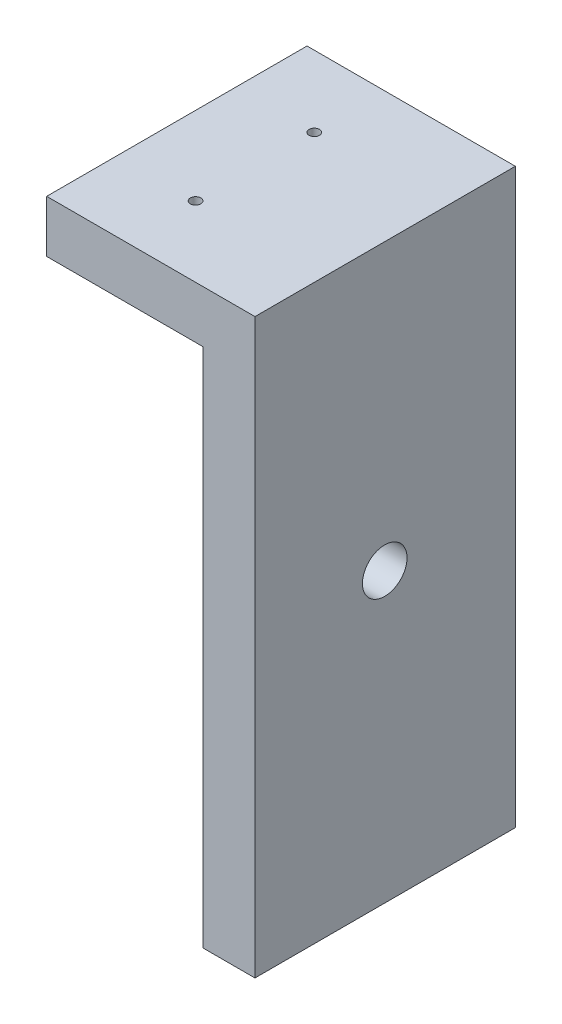
ISO-10303-21;
HEADER;
FILE_DESCRIPTION(('STEP AP214'),'2;1');
FILE_NAME('part.step','',(''),(''),'','','');
FILE_SCHEMA(('AUTOMOTIVE_DESIGN { 1 0 10303 214 1 1 1 1 }'));
ENDSEC;
DATA;
#1=APPLICATION_CONTEXT('core data for automotive mechanical design processes');
#2=APPLICATION_PROTOCOL_DEFINITION('international standard','automotive_design',2000,#1);
#3=PRODUCT_CONTEXT('',#1,'mechanical');
#4=PRODUCT('Part','Part','',(#3));
#5=PRODUCT_RELATED_PRODUCT_CATEGORY('part','',(#4));
#6=PRODUCT_DEFINITION_FORMATION('','',#4);
#7=PRODUCT_DEFINITION_CONTEXT('part definition',#1,'design');
#8=PRODUCT_DEFINITION('design','',#6,#7);
#9=PRODUCT_DEFINITION_SHAPE('','',#8);
#10=(LENGTH_UNIT() NAMED_UNIT(*) SI_UNIT(.MILLI.,.METRE.));
#11=(NAMED_UNIT(*) PLANE_ANGLE_UNIT() SI_UNIT($,.RADIAN.));
#12=(NAMED_UNIT(*) SI_UNIT($,.STERADIAN.) SOLID_ANGLE_UNIT());
#13=UNCERTAINTY_MEASURE_WITH_UNIT(LENGTH_MEASURE(1.E-05),#10,'distance_accuracy_value','');
#14=(GEOMETRIC_REPRESENTATION_CONTEXT(3) GLOBAL_UNCERTAINTY_ASSIGNED_CONTEXT((#13)) GLOBAL_UNIT_ASSIGNED_CONTEXT((#10,
#11,#12)) REPRESENTATION_CONTEXT('',''));
#15=CARTESIAN_POINT('',(0.,0.,0.));
#16=DIRECTION('',(0.,0.,1.));
#17=DIRECTION('',(1.,0.,0.));
#18=AXIS2_PLACEMENT_3D('',#15,#16,#17);
#19=CARTESIAN_POINT('',(0.,0.,5.));
#20=DIRECTION('',(1.,0.,0.));
#21=DIRECTION('',(0.,0.,-1.));
#22=AXIS2_PLACEMENT_3D('',#19,#20,#21);
#23=PLANE('',#22);
#24=CARTESIAN_POINT('',(0.,5.52898779877198,2.5080313411234));
#25=DIRECTION('',(1.,0.,0.));
#26=DIRECTION('',(0.,0.,-1.));
#27=AXIS2_PLACEMENT_3D('',#24,#25,#26);
#28=CIRCLE('',#27,0.42824506213834);
#29=CARTESIAN_POINT('',(0.,5.52898779877198,2.07978627898506));
#30=VERTEX_POINT('',#29);
#31=EDGE_CURVE('E88',#30,#30,#28,.T.);
#32=ORIENTED_EDGE('',*,*,#31,.T.);
#33=EDGE_LOOP('',(#32));
#34=FACE_BOUND('',#33,.T.);
#35=DIRECTION('',(0.,-1.,0.));
#36=VECTOR('',#35,1.);
#37=CARTESIAN_POINT('',(0.,0.,0.));
#38=LINE('',#37,#36);
#39=CARTESIAN_POINT('',(0.,10.,0.));
#40=VERTEX_POINT('',#39);
#41=CARTESIAN_POINT('',(0.,0.,0.));
#42=VERTEX_POINT('',#41);
#43=EDGE_CURVE('E95',#40,#42,#38,.T.);
#44=ORIENTED_EDGE('',*,*,#43,.T.);
#45=DIRECTION('',(0.,0.,-1.));
#46=VECTOR('',#45,1.);
#47=CARTESIAN_POINT('',(0.,0.,5.));
#48=LINE('',#47,#46);
#49=CARTESIAN_POINT('',(0.,0.,5.));
#50=VERTEX_POINT('',#49);
#51=EDGE_CURVE('E11',#50,#42,#48,.T.);
#52=ORIENTED_EDGE('',*,*,#51,.F.);
#53=DIRECTION('',(0.,-1.,0.));
#54=VECTOR('',#53,1.);
#55=CARTESIAN_POINT('',(0.,0.,5.));
#56=LINE('',#55,#54);
#57=CARTESIAN_POINT('',(0.,10.,5.));
#58=VERTEX_POINT('',#57);
#59=EDGE_CURVE('E91',#58,#50,#56,.T.);
#60=ORIENTED_EDGE('',*,*,#59,.F.);
#61=DIRECTION('',(0.,0.,-1.));
#62=VECTOR('',#61,1.);
#63=CARTESIAN_POINT('',(0.,10.,5.));
#64=LINE('',#63,#62);
#65=EDGE_CURVE('E80',#58,#40,#64,.T.);
#66=ORIENTED_EDGE('',*,*,#65,.T.);
#67=EDGE_LOOP('',(#44,#52,#60,#66));
#68=FACE_BOUND('',#67,.T.);
#69=ADVANCED_FACE('F39',(#34,#68),#23,.F.);
#70=CARTESIAN_POINT('',(0.,0.,5.));
#71=DIRECTION('',(0.,1.,0.));
#72=DIRECTION('',(0.,0.,1.));
#73=AXIS2_PLACEMENT_3D('',#70,#71,#72);
#74=PLANE('',#73);
#75=DIRECTION('',(1.,0.,0.));
#76=VECTOR('',#75,1.);
#77=CARTESIAN_POINT('',(0.,0.,0.));
#78=LINE('',#77,#76);
#79=CARTESIAN_POINT('',(1.,0.,0.));
#80=VERTEX_POINT('',#79);
#81=EDGE_CURVE('E66',#42,#80,#78,.T.);
#82=ORIENTED_EDGE('',*,*,#81,.T.);
#83=DIRECTION('',(0.,0.,-1.));
#84=VECTOR('',#83,1.);
#85=CARTESIAN_POINT('',(1.,0.,5.));
#86=LINE('',#85,#84);
#87=CARTESIAN_POINT('',(1.,0.,5.));
#88=VERTEX_POINT('',#87);
#89=EDGE_CURVE('E50',#88,#80,#86,.T.);
#90=ORIENTED_EDGE('',*,*,#89,.F.);
#91=DIRECTION('',(1.,0.,0.));
#92=VECTOR('',#91,1.);
#93=CARTESIAN_POINT('',(0.,0.,5.));
#94=LINE('',#93,#92);
#95=EDGE_CURVE('E54',#50,#88,#94,.T.);
#96=ORIENTED_EDGE('',*,*,#95,.F.);
#97=ORIENTED_EDGE('',*,*,#51,.T.);
#98=EDGE_LOOP('',(#82,#90,#96,#97));
#99=FACE_BOUND('',#98,.T.);
#100=ADVANCED_FACE('F153',(#99),#74,.F.);
#101=CARTESIAN_POINT('',(1.,0.,5.));
#102=DIRECTION('',(-1.,0.,0.));
#103=DIRECTION('',(0.,0.,1.));
#104=AXIS2_PLACEMENT_3D('',#101,#102,#103);
#105=PLANE('',#104);
#106=CARTESIAN_POINT('',(1.,5.52898779877198,2.5080313411234));
#107=DIRECTION('',(1.,0.,0.));
#108=DIRECTION('',(0.,0.,-1.));
#109=AXIS2_PLACEMENT_3D('',#106,#107,#108);
#110=CIRCLE('',#109,0.42824506213834);
#111=CARTESIAN_POINT('',(1.,5.52898779877198,2.07978627898506));
#112=VERTEX_POINT('',#111);
#113=EDGE_CURVE('E133',#112,#112,#110,.T.);
#114=ORIENTED_EDGE('',*,*,#113,.F.);
#115=EDGE_LOOP('',(#114));
#116=FACE_BOUND('',#115,.T.);
#117=DIRECTION('',(0.,1.,0.));
#118=VECTOR('',#117,1.);
#119=CARTESIAN_POINT('',(1.,0.,0.));
#120=LINE('',#119,#118);
#121=CARTESIAN_POINT('',(1.,11.,0.));
#122=VERTEX_POINT('',#121);
#123=EDGE_CURVE('E99',#80,#122,#120,.T.);
#124=ORIENTED_EDGE('',*,*,#123,.T.);
#125=DIRECTION('',(0.,0.,-1.));
#126=VECTOR('',#125,1.);
#127=CARTESIAN_POINT('',(1.,11.,0.));
#128=LINE('',#127,#126);
#129=CARTESIAN_POINT('',(1.,11.,5.));
#130=VERTEX_POINT('',#129);
#131=EDGE_CURVE('E123',#130,#122,#128,.T.);
#132=ORIENTED_EDGE('',*,*,#131,.F.);
#133=DIRECTION('',(0.,1.,0.));
#134=VECTOR('',#133,1.);
#135=CARTESIAN_POINT('',(1.,0.,5.));
#136=LINE('',#135,#134);
#137=EDGE_CURVE('E94',#88,#130,#136,.T.);
#138=ORIENTED_EDGE('',*,*,#137,.F.);
#139=ORIENTED_EDGE('',*,*,#89,.T.);
#140=EDGE_LOOP('',(#124,#132,#138,#139));
#141=FACE_BOUND('',#140,.T.);
#142=ADVANCED_FACE('F109',(#116,#141),#105,.F.);
#143=CARTESIAN_POINT('',(0.,0.,5.));
#144=DIRECTION('',(0.,0.,-1.));
#145=DIRECTION('',(-1.,0.,0.));
#146=AXIS2_PLACEMENT_3D('',#143,#144,#145);
#147=PLANE('',#146);
#148=ORIENTED_EDGE('',*,*,#59,.T.);
#149=ORIENTED_EDGE('',*,*,#95,.T.);
#150=ORIENTED_EDGE('',*,*,#137,.T.);
#151=DIRECTION('',(1.,0.,0.));
#152=VECTOR('',#151,1.);
#153=CARTESIAN_POINT('',(1.,11.,5.));
#154=LINE('',#153,#152);
#155=CARTESIAN_POINT('',(-3.,11.,5.));
#156=VERTEX_POINT('',#155);
#157=EDGE_CURVE('E128',#156,#130,#154,.T.);
#158=ORIENTED_EDGE('',*,*,#157,.F.);
#159=DIRECTION('',(0.,-1.,0.));
#160=VECTOR('',#159,1.);
#161=CARTESIAN_POINT('',(-3.,11.,5.));
#162=LINE('',#161,#160);
#163=CARTESIAN_POINT('',(-3.,10.,5.));
#164=VERTEX_POINT('',#163);
#165=EDGE_CURVE('E105',#156,#164,#162,.T.);
#166=ORIENTED_EDGE('',*,*,#165,.T.);
#167=DIRECTION('',(1.,0.,0.));
#168=VECTOR('',#167,1.);
#169=CARTESIAN_POINT('',(1.,10.,5.));
#170=LINE('',#169,#168);
#171=EDGE_CURVE('E132',#164,#58,#170,.T.);
#172=ORIENTED_EDGE('',*,*,#171,.T.);
#173=EDGE_LOOP('',(#148,#149,#150,#158,#166,#172));
#174=FACE_BOUND('',#173,.T.);
#175=ADVANCED_FACE('F141',(#174),#147,.F.);
#176=CARTESIAN_POINT('',(0.,0.,0.));
#177=DIRECTION('',(0.,0.,-1.));
#178=DIRECTION('',(-1.,0.,0.));
#179=AXIS2_PLACEMENT_3D('',#176,#177,#178);
#180=PLANE('',#179);
#181=ORIENTED_EDGE('',*,*,#43,.F.);
#182=DIRECTION('',(-1.,0.,0.));
#183=VECTOR('',#182,1.);
#184=CARTESIAN_POINT('',(1.,10.,0.));
#185=LINE('',#184,#183);
#186=CARTESIAN_POINT('',(-3.,10.,0.));
#187=VERTEX_POINT('',#186);
#188=EDGE_CURVE('E71',#40,#187,#185,.T.);
#189=ORIENTED_EDGE('',*,*,#188,.T.);
#190=DIRECTION('',(0.,-1.,0.));
#191=VECTOR('',#190,1.);
#192=CARTESIAN_POINT('',(-3.,11.,0.));
#193=LINE('',#192,#191);
#194=CARTESIAN_POINT('',(-3.,11.,0.));
#195=VERTEX_POINT('',#194);
#196=EDGE_CURVE('E98',#195,#187,#193,.T.);
#197=ORIENTED_EDGE('',*,*,#196,.F.);
#198=DIRECTION('',(-1.,0.,0.));
#199=VECTOR('',#198,1.);
#200=CARTESIAN_POINT('',(1.,11.,0.));
#201=LINE('',#200,#199);
#202=EDGE_CURVE('E113',#122,#195,#201,.T.);
#203=ORIENTED_EDGE('',*,*,#202,.F.);
#204=ORIENTED_EDGE('',*,*,#123,.F.);
#205=ORIENTED_EDGE('',*,*,#81,.F.);
#206=EDGE_LOOP('',(#181,#189,#197,#203,#204,#205));
#207=FACE_BOUND('',#206,.T.);
#208=ADVANCED_FACE('F96',(#207),#180,.T.);
#209=CARTESIAN_POINT('',(0.,10.,0.));
#210=DIRECTION('',(0.,-1.,0.));
#211=DIRECTION('',(0.,0.,-1.));
#212=AXIS2_PLACEMENT_3D('',#209,#210,#211);
#213=PLANE('',#212);
#214=CARTESIAN_POINT('',(-1.49411020634042,10.,1.36684059345927));
#215=DIRECTION('',(0.,-1.,0.));
#216=DIRECTION('',(0.,0.,-1.));
#217=AXIS2_PLACEMENT_3D('',#214,#215,#216);
#218=CIRCLE('',#217,0.1);
#219=CARTESIAN_POINT('',(-1.49411020634042,10.,1.26684059345927));
#220=VERTEX_POINT('',#219);
#221=EDGE_CURVE('E193',#220,#220,#218,.T.);
#222=ORIENTED_EDGE('',*,*,#221,.F.);
#223=EDGE_LOOP('',(#222));
#224=FACE_BOUND('',#223,.T.);
#225=CARTESIAN_POINT('',(-1.49411020634042,10.,3.64633567870975));
#226=DIRECTION('',(0.,-1.,0.));
#227=DIRECTION('',(0.,0.,-1.));
#228=AXIS2_PLACEMENT_3D('',#225,#226,#227);
#229=CIRCLE('',#228,0.1);
#230=CARTESIAN_POINT('',(-1.49411020634042,10.,3.54633567870975));
#231=VERTEX_POINT('',#230);
#232=EDGE_CURVE('E195',#231,#231,#229,.T.);
#233=ORIENTED_EDGE('',*,*,#232,.F.);
#234=EDGE_LOOP('',(#233));
#235=FACE_BOUND('',#234,.T.);
#236=ORIENTED_EDGE('',*,*,#65,.F.);
#237=ORIENTED_EDGE('',*,*,#171,.F.);
#238=DIRECTION('',(0.,0.,1.));
#239=VECTOR('',#238,1.);
#240=CARTESIAN_POINT('',(-3.,10.,0.));
#241=LINE('',#240,#239);
#242=EDGE_CURVE('E81',#187,#164,#241,.T.);
#243=ORIENTED_EDGE('',*,*,#242,.F.);
#244=ORIENTED_EDGE('',*,*,#188,.F.);
#245=EDGE_LOOP('',(#236,#237,#243,#244));
#246=FACE_BOUND('',#245,.T.);
#247=ADVANCED_FACE('F73',(#224,#235,#246),#213,.T.);
#248=CARTESIAN_POINT('',(-3.,11.,0.));
#249=DIRECTION('',(1.,0.,0.));
#250=DIRECTION('',(0.,0.,-1.));
#251=AXIS2_PLACEMENT_3D('',#248,#249,#250);
#252=PLANE('',#251);
#253=ORIENTED_EDGE('',*,*,#242,.T.);
#254=ORIENTED_EDGE('',*,*,#165,.F.);
#255=DIRECTION('',(0.,0.,1.));
#256=VECTOR('',#255,1.);
#257=CARTESIAN_POINT('',(-3.,11.,0.));
#258=LINE('',#257,#256);
#259=EDGE_CURVE('E124',#195,#156,#258,.T.);
#260=ORIENTED_EDGE('',*,*,#259,.F.);
#261=ORIENTED_EDGE('',*,*,#196,.T.);
#262=EDGE_LOOP('',(#253,#254,#260,#261));
#263=FACE_BOUND('',#262,.T.);
#264=ADVANCED_FACE('F155',(#263),#252,.F.);
#265=CARTESIAN_POINT('',(0.,11.,0.));
#266=DIRECTION('',(0.,-1.,0.));
#267=DIRECTION('',(0.,0.,-1.));
#268=AXIS2_PLACEMENT_3D('',#265,#266,#267);
#269=PLANE('',#268);
#270=CARTESIAN_POINT('',(-1.49411020634042,11.,1.36684059345927));
#271=DIRECTION('',(0.,-1.,0.));
#272=DIRECTION('',(0.,0.,-1.));
#273=AXIS2_PLACEMENT_3D('',#270,#271,#272);
#274=CIRCLE('',#273,0.1);
#275=CARTESIAN_POINT('',(-1.49411020634042,11.,1.26684059345927));
#276=VERTEX_POINT('',#275);
#277=EDGE_CURVE('E191',#276,#276,#274,.T.);
#278=ORIENTED_EDGE('',*,*,#277,.T.);
#279=EDGE_LOOP('',(#278));
#280=FACE_BOUND('',#279,.T.);
#281=CARTESIAN_POINT('',(-1.49411020634042,11.,3.64633567870975));
#282=DIRECTION('',(0.,-1.,0.));
#283=DIRECTION('',(0.,0.,-1.));
#284=AXIS2_PLACEMENT_3D('',#281,#282,#283);
#285=CIRCLE('',#284,0.1);
#286=CARTESIAN_POINT('',(-1.49411020634042,11.,3.54633567870975));
#287=VERTEX_POINT('',#286);
#288=EDGE_CURVE('E200',#287,#287,#285,.T.);
#289=ORIENTED_EDGE('',*,*,#288,.T.);
#290=EDGE_LOOP('',(#289));
#291=FACE_BOUND('',#290,.T.);
#292=ORIENTED_EDGE('',*,*,#131,.T.);
#293=ORIENTED_EDGE('',*,*,#202,.T.);
#294=ORIENTED_EDGE('',*,*,#259,.T.);
#295=ORIENTED_EDGE('',*,*,#157,.T.);
#296=EDGE_LOOP('',(#292,#293,#294,#295));
#297=FACE_BOUND('',#296,.T.);
#298=ADVANCED_FACE('F130',(#280,#291,#297),#269,.F.);
#299=CARTESIAN_POINT('',(0.,5.52898779877198,2.5080313411234));
#300=DIRECTION('',(1.,0.,0.));
#301=DIRECTION('',(0.,0.,-1.));
#302=AXIS2_PLACEMENT_3D('',#299,#300,#301);
#303=CYLINDRICAL_SURFACE('',#302,0.42824506213834);
#304=ORIENTED_EDGE('',*,*,#31,.F.);
#305=EDGE_LOOP('',(#304));
#306=FACE_BOUND('',#305,.T.);
#307=ORIENTED_EDGE('',*,*,#113,.T.);
#308=EDGE_LOOP('',(#307));
#309=FACE_BOUND('',#308,.T.);
#310=ADVANCED_FACE('F171',(#306,#309),#303,.F.);
#311=CARTESIAN_POINT('',(-1.49411020634042,11.,3.64633567870975));
#312=DIRECTION('',(0.,-1.,0.));
#313=DIRECTION('',(0.,0.,-1.));
#314=AXIS2_PLACEMENT_3D('',#311,#312,#313);
#315=CYLINDRICAL_SURFACE('',#314,0.1);
#316=ORIENTED_EDGE('',*,*,#288,.F.);
#317=EDGE_LOOP('',(#316));
#318=FACE_BOUND('',#317,.T.);
#319=ORIENTED_EDGE('',*,*,#232,.T.);
#320=EDGE_LOOP('',(#319));
#321=FACE_BOUND('',#320,.T.);
#322=ADVANCED_FACE('F179',(#318,#321),#315,.F.);
#323=CARTESIAN_POINT('',(-1.49411020634042,11.,1.36684059345927));
#324=DIRECTION('',(0.,-1.,0.));
#325=DIRECTION('',(0.,0.,-1.));
#326=AXIS2_PLACEMENT_3D('',#323,#324,#325);
#327=CYLINDRICAL_SURFACE('',#326,0.1);
#328=ORIENTED_EDGE('',*,*,#277,.F.);
#329=EDGE_LOOP('',(#328));
#330=FACE_BOUND('',#329,.T.);
#331=ORIENTED_EDGE('',*,*,#221,.T.);
#332=EDGE_LOOP('',(#331));
#333=FACE_BOUND('',#332,.T.);
#334=ADVANCED_FACE('F185',(#330,#333),#327,.F.);
#335=CLOSED_SHELL('',(#69,#100,#142,#175,#208,#247,#264,#298,#310,#322,#334));
#336=MANIFOLD_SOLID_BREP('B2',#335);
#337=ADVANCED_BREP_SHAPE_REPRESENTATION('',(#18,#336),#14);
#338=SHAPE_DEFINITION_REPRESENTATION(#9,#337);
ENDSEC;
END-ISO-10303-21;
